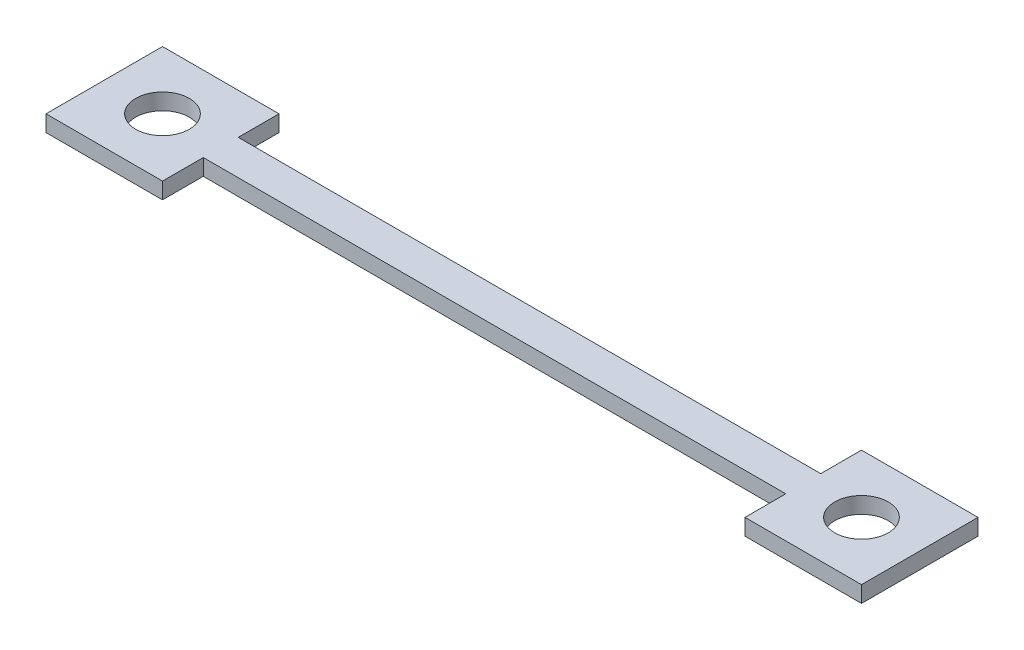
ISO-10303-21;
HEADER;
FILE_DESCRIPTION(('STEP AP214'),'2;1');
FILE_NAME('part.step','',(''),(''),'','','');
FILE_SCHEMA(('AUTOMOTIVE_DESIGN { 1 0 10303 214 1 1 1 1 }'));
ENDSEC;
DATA;
#1=APPLICATION_CONTEXT('core data for automotive mechanical design processes');
#2=APPLICATION_PROTOCOL_DEFINITION('international standard','automotive_design',2000,#1);
#3=PRODUCT_CONTEXT('',#1,'mechanical');
#4=PRODUCT('Part','Part','',(#3));
#5=PRODUCT_RELATED_PRODUCT_CATEGORY('part','',(#4));
#6=PRODUCT_DEFINITION_FORMATION('','',#4);
#7=PRODUCT_DEFINITION_CONTEXT('part definition',#1,'design');
#8=PRODUCT_DEFINITION('design','',#6,#7);
#9=PRODUCT_DEFINITION_SHAPE('','',#8);
#10=(LENGTH_UNIT() NAMED_UNIT(*) SI_UNIT(.MILLI.,.METRE.));
#11=(NAMED_UNIT(*) PLANE_ANGLE_UNIT() SI_UNIT($,.RADIAN.));
#12=(NAMED_UNIT(*) SI_UNIT($,.STERADIAN.) SOLID_ANGLE_UNIT());
#13=UNCERTAINTY_MEASURE_WITH_UNIT(LENGTH_MEASURE(1.E-05),#10,'distance_accuracy_value','');
#14=(GEOMETRIC_REPRESENTATION_CONTEXT(3) GLOBAL_UNCERTAINTY_ASSIGNED_CONTEXT((#13)) GLOBAL_UNIT_ASSIGNED_CONTEXT((#10,
#11,#12)) REPRESENTATION_CONTEXT('',''));
#15=CARTESIAN_POINT('',(0.,0.,0.));
#16=DIRECTION('',(0.,0.,1.));
#17=DIRECTION('',(1.,0.,0.));
#18=AXIS2_PLACEMENT_3D('',#15,#16,#17);
#19=CARTESIAN_POINT('',(-9.67404648456241,0.4445,6.15575946530759));
#20=DIRECTION('',(0.,0.,1.));
#21=DIRECTION('',(1.,0.,0.));
#22=AXIS2_PLACEMENT_3D('',#19,#20,#21);
#23=PLANE('',#22);
#24=DIRECTION('',(-1.,0.,0.));
#25=VECTOR('',#24,1.);
#26=CARTESIAN_POINT('',(-9.67404648456241,-0.4445,6.15575946530759));
#27=LINE('',#26,#25);
#28=CARTESIAN_POINT('',(-3.32404648456241,-0.4445,6.15575946530759));
#29=VERTEX_POINT('',#28);
#30=CARTESIAN_POINT('',(-9.67404648456241,-0.4445,6.15575946530759));
#31=VERTEX_POINT('',#30);
#32=EDGE_CURVE('E164',#29,#31,#27,.T.);
#33=ORIENTED_EDGE('',*,*,#32,.T.);
#34=DIRECTION('',(0.,-1.,0.));
#35=VECTOR('',#34,1.);
#36=CARTESIAN_POINT('',(-9.67404648456241,0.4445,6.15575946530759));
#37=LINE('',#36,#35);
#38=CARTESIAN_POINT('',(-9.67404648456241,0.4445,6.15575946530759));
#39=VERTEX_POINT('',#38);
#40=EDGE_CURVE('E11',#39,#31,#37,.T.);
#41=ORIENTED_EDGE('',*,*,#40,.F.);
#42=DIRECTION('',(-1.,0.,0.));
#43=VECTOR('',#42,1.);
#44=CARTESIAN_POINT('',(-9.67404648456241,0.4445,6.15575946530759));
#45=LINE('',#44,#43);
#46=CARTESIAN_POINT('',(-3.32404648456241,0.4445,6.15575946530759));
#47=VERTEX_POINT('',#46);
#48=EDGE_CURVE('E199',#47,#39,#45,.T.);
#49=ORIENTED_EDGE('',*,*,#48,.F.);
#50=DIRECTION('',(0.,-1.,0.));
#51=VECTOR('',#50,1.);
#52=CARTESIAN_POINT('',(-3.32404648456241,0.4445,6.15575946530759));
#53=LINE('',#52,#51);
#54=EDGE_CURVE('E160',#47,#29,#53,.T.);
#55=ORIENTED_EDGE('',*,*,#54,.T.);
#56=EDGE_LOOP('',(#33,#41,#49,#55));
#57=FACE_BOUND('',#56,.T.);
#58=ADVANCED_FACE('F39',(#57),#23,.F.);
#59=CARTESIAN_POINT('',(-9.67404648456241,0.4445,8.37825946530759));
#60=DIRECTION('',(1.,0.,0.));
#61=DIRECTION('',(0.,0.,-1.));
#62=AXIS2_PLACEMENT_3D('',#59,#60,#61);
#63=PLANE('',#62);
#64=DIRECTION('',(0.,0.,1.));
#65=VECTOR('',#64,1.);
#66=CARTESIAN_POINT('',(-9.67404648456241,-0.4445,8.37825946530759));
#67=LINE('',#66,#65);
#68=CARTESIAN_POINT('',(-9.67404648456241,-0.4445,8.37825946530759));
#69=VERTEX_POINT('',#68);
#70=EDGE_CURVE('E168',#31,#69,#67,.T.);
#71=ORIENTED_EDGE('',*,*,#70,.T.);
#72=DIRECTION('',(0.,-1.,0.));
#73=VECTOR('',#72,1.);
#74=CARTESIAN_POINT('',(-9.67404648456241,0.4445,8.37825946530759));
#75=LINE('',#74,#73);
#76=CARTESIAN_POINT('',(-9.67404648456241,0.4445,8.37825946530759));
#77=VERTEX_POINT('',#76);
#78=EDGE_CURVE('E48',#77,#69,#75,.T.);
#79=ORIENTED_EDGE('',*,*,#78,.F.);
#80=DIRECTION('',(0.,0.,1.));
#81=VECTOR('',#80,1.);
#82=CARTESIAN_POINT('',(-9.67404648456241,0.4445,8.37825946530759));
#83=LINE('',#82,#81);
#84=EDGE_CURVE('E111',#39,#77,#83,.T.);
#85=ORIENTED_EDGE('',*,*,#84,.F.);
#86=ORIENTED_EDGE('',*,*,#40,.T.);
#87=EDGE_LOOP('',(#71,#79,#85,#86));
#88=FACE_BOUND('',#87,.T.);
#89=ADVANCED_FACE('F294',(#88),#63,.F.);
#90=CARTESIAN_POINT('',(-41.4240464845624,0.4445,8.37825946530759));
#91=DIRECTION('',(0.,0.,1.));
#92=DIRECTION('',(1.,0.,0.));
#93=AXIS2_PLACEMENT_3D('',#90,#91,#92);
#94=PLANE('',#93);
#95=DIRECTION('',(-1.,0.,0.));
#96=VECTOR('',#95,1.);
#97=CARTESIAN_POINT('',(-41.4240464845624,-0.4445,8.37825946530759));
#98=LINE('',#97,#96);
#99=CARTESIAN_POINT('',(-41.4240464845624,-0.4445,8.37825946530759));
#100=VERTEX_POINT('',#99);
#101=EDGE_CURVE('E172',#69,#100,#98,.T.);
#102=ORIENTED_EDGE('',*,*,#101,.T.);
#103=DIRECTION('',(0.,-1.,0.));
#104=VECTOR('',#103,1.);
#105=CARTESIAN_POINT('',(-41.4240464845624,0.4445,8.37825946530759));
#106=LINE('',#105,#104);
#107=CARTESIAN_POINT('',(-41.4240464845624,0.4445,8.37825946530759));
#108=VERTEX_POINT('',#107);
#109=EDGE_CURVE('E226',#108,#100,#106,.T.);
#110=ORIENTED_EDGE('',*,*,#109,.F.);
#111=DIRECTION('',(-1.,0.,0.));
#112=VECTOR('',#111,1.);
#113=CARTESIAN_POINT('',(-41.4240464845624,0.4445,8.37825946530759));
#114=LINE('',#113,#112);
#115=EDGE_CURVE('E236',#77,#108,#114,.T.);
#116=ORIENTED_EDGE('',*,*,#115,.F.);
#117=ORIENTED_EDGE('',*,*,#78,.T.);
#118=EDGE_LOOP('',(#102,#110,#116,#117));
#119=FACE_BOUND('',#118,.T.);
#120=ADVANCED_FACE('F234',(#119),#94,.F.);
#121=CARTESIAN_POINT('',(-41.4240464845624,0.4445,8.37825946530759));
#122=DIRECTION('',(-1.,0.,0.));
#123=DIRECTION('',(0.,0.,1.));
#124=AXIS2_PLACEMENT_3D('',#121,#122,#123);
#125=PLANE('',#124);
#126=DIRECTION('',(0.,0.,-1.));
#127=VECTOR('',#126,1.);
#128=CARTESIAN_POINT('',(-41.4240464845624,-0.4445,8.37825946530759));
#129=LINE('',#128,#127);
#130=CARTESIAN_POINT('',(-41.4240464845624,-0.4445,6.15575946530758));
#131=VERTEX_POINT('',#130);
#132=EDGE_CURVE('E175',#100,#131,#129,.T.);
#133=ORIENTED_EDGE('',*,*,#132,.T.);
#134=DIRECTION('',(0.,-1.,0.));
#135=VECTOR('',#134,1.);
#136=CARTESIAN_POINT('',(-41.4240464845624,0.4445,6.15575946530758));
#137=LINE('',#136,#135);
#138=CARTESIAN_POINT('',(-41.4240464845624,0.4445,6.15575946530758));
#139=VERTEX_POINT('',#138);
#140=EDGE_CURVE('E222',#139,#131,#137,.T.);
#141=ORIENTED_EDGE('',*,*,#140,.F.);
#142=DIRECTION('',(0.,0.,-1.));
#143=VECTOR('',#142,1.);
#144=CARTESIAN_POINT('',(-41.4240464845624,0.4445,8.37825946530759));
#145=LINE('',#144,#143);
#146=EDGE_CURVE('E255',#108,#139,#145,.T.);
#147=ORIENTED_EDGE('',*,*,#146,.F.);
#148=ORIENTED_EDGE('',*,*,#109,.T.);
#149=EDGE_LOOP('',(#133,#141,#147,#148));
#150=FACE_BOUND('',#149,.T.);
#151=ADVANCED_FACE('F245',(#150),#125,.F.);
#152=CARTESIAN_POINT('',(-47.7740464845624,0.4445,6.15575946530758));
#153=DIRECTION('',(0.,0.,1.));
#154=DIRECTION('',(1.,0.,0.));
#155=AXIS2_PLACEMENT_3D('',#152,#153,#154);
#156=PLANE('',#155);
#157=DIRECTION('',(-1.,0.,0.));
#158=VECTOR('',#157,1.);
#159=CARTESIAN_POINT('',(-47.7740464845624,-0.4445,6.15575946530758));
#160=LINE('',#159,#158);
#161=CARTESIAN_POINT('',(-47.7740464845624,-0.4445,6.15575946530758));
#162=VERTEX_POINT('',#161);
#163=EDGE_CURVE('E178',#131,#162,#160,.T.);
#164=ORIENTED_EDGE('',*,*,#163,.T.);
#165=DIRECTION('',(0.,-1.,0.));
#166=VECTOR('',#165,1.);
#167=CARTESIAN_POINT('',(-47.7740464845624,0.4445,6.15575946530758));
#168=LINE('',#167,#166);
#169=CARTESIAN_POINT('',(-47.7740464845624,0.4445,6.15575946530758));
#170=VERTEX_POINT('',#169);
#171=EDGE_CURVE('E218',#170,#162,#168,.T.);
#172=ORIENTED_EDGE('',*,*,#171,.F.);
#173=DIRECTION('',(-1.,0.,0.));
#174=VECTOR('',#173,1.);
#175=CARTESIAN_POINT('',(-47.7740464845624,0.4445,6.15575946530758));
#176=LINE('',#175,#174);
#177=EDGE_CURVE('E251',#139,#170,#176,.T.);
#178=ORIENTED_EDGE('',*,*,#177,.F.);
#179=ORIENTED_EDGE('',*,*,#140,.T.);
#180=EDGE_LOOP('',(#164,#172,#178,#179));
#181=FACE_BOUND('',#180,.T.);
#182=ADVANCED_FACE('F249',(#181),#156,.F.);
#183=CARTESIAN_POINT('',(-47.7740464845624,0.4445,12.5057594653076));
#184=DIRECTION('',(1.,0.,0.));
#185=DIRECTION('',(0.,0.,-1.));
#186=AXIS2_PLACEMENT_3D('',#183,#184,#185);
#187=PLANE('',#186);
#188=DIRECTION('',(0.,0.,1.));
#189=VECTOR('',#188,1.);
#190=CARTESIAN_POINT('',(-47.7740464845624,-0.4445,12.5057594653076));
#191=LINE('',#190,#189);
#192=CARTESIAN_POINT('',(-47.7740464845624,-0.4445,12.5057594653076));
#193=VERTEX_POINT('',#192);
#194=EDGE_CURVE('E181',#162,#193,#191,.T.);
#195=ORIENTED_EDGE('',*,*,#194,.T.);
#196=DIRECTION('',(0.,-1.,0.));
#197=VECTOR('',#196,1.);
#198=CARTESIAN_POINT('',(-47.7740464845624,0.4445,12.5057594653076));
#199=LINE('',#198,#197);
#200=CARTESIAN_POINT('',(-47.7740464845624,0.4445,12.5057594653076));
#201=VERTEX_POINT('',#200);
#202=EDGE_CURVE('E214',#201,#193,#199,.T.);
#203=ORIENTED_EDGE('',*,*,#202,.F.);
#204=DIRECTION('',(0.,0.,1.));
#205=VECTOR('',#204,1.);
#206=CARTESIAN_POINT('',(-47.7740464845624,0.4445,12.5057594653076));
#207=LINE('',#206,#205);
#208=EDGE_CURVE('E254',#170,#201,#207,.T.);
#209=ORIENTED_EDGE('',*,*,#208,.F.);
#210=ORIENTED_EDGE('',*,*,#171,.T.);
#211=EDGE_LOOP('',(#195,#203,#209,#210));
#212=FACE_BOUND('',#211,.T.);
#213=ADVANCED_FACE('F307',(#212),#187,.F.);
#214=CARTESIAN_POINT('',(-47.7740464845624,0.4445,12.5057594653076));
#215=DIRECTION('',(0.,0.,-1.));
#216=DIRECTION('',(-1.,0.,0.));
#217=AXIS2_PLACEMENT_3D('',#214,#215,#216);
#218=PLANE('',#217);
#219=DIRECTION('',(1.,0.,0.));
#220=VECTOR('',#219,1.);
#221=CARTESIAN_POINT('',(-47.7740464845624,-0.4445,12.5057594653076));
#222=LINE('',#221,#220);
#223=CARTESIAN_POINT('',(-41.4240464845624,-0.4445,12.5057594653076));
#224=VERTEX_POINT('',#223);
#225=EDGE_CURVE('E184',#193,#224,#222,.T.);
#226=ORIENTED_EDGE('',*,*,#225,.T.);
#227=DIRECTION('',(0.,-1.,0.));
#228=VECTOR('',#227,1.);
#229=CARTESIAN_POINT('',(-41.4240464845624,0.4445,12.5057594653076));
#230=LINE('',#229,#228);
#231=CARTESIAN_POINT('',(-41.4240464845624,0.4445,12.5057594653076));
#232=VERTEX_POINT('',#231);
#233=EDGE_CURVE('E210',#232,#224,#230,.T.);
#234=ORIENTED_EDGE('',*,*,#233,.F.);
#235=DIRECTION('',(1.,0.,0.));
#236=VECTOR('',#235,1.);
#237=CARTESIAN_POINT('',(-47.7740464845624,0.4445,12.5057594653076));
#238=LINE('',#237,#236);
#239=EDGE_CURVE('E259',#201,#232,#238,.T.);
#240=ORIENTED_EDGE('',*,*,#239,.F.);
#241=ORIENTED_EDGE('',*,*,#202,.T.);
#242=EDGE_LOOP('',(#226,#234,#240,#241));
#243=FACE_BOUND('',#242,.T.);
#244=ADVANCED_FACE('F310',(#243),#218,.F.);
#245=CARTESIAN_POINT('',(-41.4240464845624,0.4445,10.2832594653076));
#246=DIRECTION('',(-1.,0.,0.));
#247=DIRECTION('',(0.,0.,1.));
#248=AXIS2_PLACEMENT_3D('',#245,#246,#247);
#249=PLANE('',#248);
#250=DIRECTION('',(0.,0.,-1.));
#251=VECTOR('',#250,1.);
#252=CARTESIAN_POINT('',(-41.4240464845624,-0.4445,10.2832594653076));
#253=LINE('',#252,#251);
#254=CARTESIAN_POINT('',(-41.4240464845624,-0.4445,10.2832594653076));
#255=VERTEX_POINT('',#254);
#256=EDGE_CURVE('E187',#224,#255,#253,.T.);
#257=ORIENTED_EDGE('',*,*,#256,.T.);
#258=DIRECTION('',(0.,-1.,0.));
#259=VECTOR('',#258,1.);
#260=CARTESIAN_POINT('',(-41.4240464845624,0.4445,10.2832594653076));
#261=LINE('',#260,#259);
#262=CARTESIAN_POINT('',(-41.4240464845624,0.4445,10.2832594653076));
#263=VERTEX_POINT('',#262);
#264=EDGE_CURVE('E206',#263,#255,#261,.T.);
#265=ORIENTED_EDGE('',*,*,#264,.F.);
#266=DIRECTION('',(0.,0.,-1.));
#267=VECTOR('',#266,1.);
#268=CARTESIAN_POINT('',(-41.4240464845624,0.4445,10.2832594653076));
#269=LINE('',#268,#267);
#270=EDGE_CURVE('E266',#232,#263,#269,.T.);
#271=ORIENTED_EDGE('',*,*,#270,.F.);
#272=ORIENTED_EDGE('',*,*,#233,.T.);
#273=EDGE_LOOP('',(#257,#265,#271,#272));
#274=FACE_BOUND('',#273,.T.);
#275=ADVANCED_FACE('F274',(#274),#249,.F.);
#276=CARTESIAN_POINT('',(-41.4240464845624,0.4445,10.2832594653076));
#277=DIRECTION('',(0.,0.,-1.));
#278=DIRECTION('',(-1.,0.,0.));
#279=AXIS2_PLACEMENT_3D('',#276,#277,#278);
#280=PLANE('',#279);
#281=DIRECTION('',(1.,0.,0.));
#282=VECTOR('',#281,1.);
#283=CARTESIAN_POINT('',(-41.4240464845624,-0.4445,10.2832594653076));
#284=LINE('',#283,#282);
#285=CARTESIAN_POINT('',(-9.67404648456241,-0.4445,10.2832594653076));
#286=VERTEX_POINT('',#285);
#287=EDGE_CURVE('E190',#255,#286,#284,.T.);
#288=ORIENTED_EDGE('',*,*,#287,.T.);
#289=DIRECTION('',(0.,-1.,0.));
#290=VECTOR('',#289,1.);
#291=CARTESIAN_POINT('',(-9.67404648456241,0.4445,10.2832594653076));
#292=LINE('',#291,#290);
#293=CARTESIAN_POINT('',(-9.67404648456241,0.4445,10.2832594653076));
#294=VERTEX_POINT('',#293);
#295=EDGE_CURVE('E153',#294,#286,#292,.T.);
#296=ORIENTED_EDGE('',*,*,#295,.F.);
#297=DIRECTION('',(1.,0.,0.));
#298=VECTOR('',#297,1.);
#299=CARTESIAN_POINT('',(-41.4240464845624,0.4445,10.2832594653076));
#300=LINE('',#299,#298);
#301=EDGE_CURVE('E142',#263,#294,#300,.T.);
#302=ORIENTED_EDGE('',*,*,#301,.F.);
#303=ORIENTED_EDGE('',*,*,#264,.T.);
#304=EDGE_LOOP('',(#288,#296,#302,#303));
#305=FACE_BOUND('',#304,.T.);
#306=ADVANCED_FACE('F278',(#305),#280,.F.);
#307=CARTESIAN_POINT('',(-9.67404648456241,0.4445,10.2832594653076));
#308=DIRECTION('',(1.,0.,0.));
#309=DIRECTION('',(0.,0.,-1.));
#310=AXIS2_PLACEMENT_3D('',#307,#308,#309);
#311=PLANE('',#310);
#312=DIRECTION('',(0.,0.,1.));
#313=VECTOR('',#312,1.);
#314=CARTESIAN_POINT('',(-9.67404648456241,-0.4445,10.2832594653076));
#315=LINE('',#314,#313);
#316=CARTESIAN_POINT('',(-9.67404648456241,-0.4445,12.5057594653076));
#317=VERTEX_POINT('',#316);
#318=EDGE_CURVE('E151',#286,#317,#315,.T.);
#319=ORIENTED_EDGE('',*,*,#318,.T.);
#320=DIRECTION('',(0.,-1.,0.));
#321=VECTOR('',#320,1.);
#322=CARTESIAN_POINT('',(-9.67404648456241,0.4445,12.5057594653076));
#323=LINE('',#322,#321);
#324=CARTESIAN_POINT('',(-9.67404648456241,0.4445,12.5057594653076));
#325=VERTEX_POINT('',#324);
#326=EDGE_CURVE('E148',#325,#317,#323,.T.);
#327=ORIENTED_EDGE('',*,*,#326,.F.);
#328=DIRECTION('',(0.,0.,1.));
#329=VECTOR('',#328,1.);
#330=CARTESIAN_POINT('',(-9.67404648456241,0.4445,10.2832594653076));
#331=LINE('',#330,#329);
#332=EDGE_CURVE('E136',#294,#325,#331,.T.);
#333=ORIENTED_EDGE('',*,*,#332,.F.);
#334=ORIENTED_EDGE('',*,*,#295,.T.);
#335=EDGE_LOOP('',(#319,#327,#333,#334));
#336=FACE_BOUND('',#335,.T.);
#337=ADVANCED_FACE('F149',(#336),#311,.F.);
#338=CARTESIAN_POINT('',(-9.67404648456241,0.4445,12.5057594653076));
#339=DIRECTION('',(0.,0.,-1.));
#340=DIRECTION('',(-1.,0.,0.));
#341=AXIS2_PLACEMENT_3D('',#338,#339,#340);
#342=PLANE('',#341);
#343=DIRECTION('',(1.,0.,0.));
#344=VECTOR('',#343,1.);
#345=CARTESIAN_POINT('',(-9.67404648456241,-0.4445,12.5057594653076));
#346=LINE('',#345,#344);
#347=CARTESIAN_POINT('',(-3.32404648456241,-0.4445,12.5057594653076));
#348=VERTEX_POINT('',#347);
#349=EDGE_CURVE('E97',#317,#348,#346,.T.);
#350=ORIENTED_EDGE('',*,*,#349,.T.);
#351=DIRECTION('',(0.,-1.,0.));
#352=VECTOR('',#351,1.);
#353=CARTESIAN_POINT('',(-3.32404648456241,0.4445,12.5057594653076));
#354=LINE('',#353,#352);
#355=CARTESIAN_POINT('',(-3.32404648456241,0.4445,12.5057594653076));
#356=VERTEX_POINT('',#355);
#357=EDGE_CURVE('E154',#356,#348,#354,.T.);
#358=ORIENTED_EDGE('',*,*,#357,.F.);
#359=DIRECTION('',(1.,0.,0.));
#360=VECTOR('',#359,1.);
#361=CARTESIAN_POINT('',(-9.67404648456241,0.4445,12.5057594653076));
#362=LINE('',#361,#360);
#363=EDGE_CURVE('E140',#325,#356,#362,.T.);
#364=ORIENTED_EDGE('',*,*,#363,.F.);
#365=ORIENTED_EDGE('',*,*,#326,.T.);
#366=EDGE_LOOP('',(#350,#358,#364,#365));
#367=FACE_BOUND('',#366,.T.);
#368=ADVANCED_FACE('F156',(#367),#342,.F.);
#369=CARTESIAN_POINT('',(-3.32404648456241,0.4445,12.5057594653076));
#370=DIRECTION('',(-1.,0.,0.));
#371=DIRECTION('',(0.,0.,1.));
#372=AXIS2_PLACEMENT_3D('',#369,#370,#371);
#373=PLANE('',#372);
#374=DIRECTION('',(0.,0.,-1.));
#375=VECTOR('',#374,1.);
#376=CARTESIAN_POINT('',(-3.32404648456241,-0.4445,12.5057594653076));
#377=LINE('',#376,#375);
#378=EDGE_CURVE('E103',#348,#29,#377,.T.);
#379=ORIENTED_EDGE('',*,*,#378,.T.);
#380=ORIENTED_EDGE('',*,*,#54,.F.);
#381=DIRECTION('',(0.,0.,-1.));
#382=VECTOR('',#381,1.);
#383=CARTESIAN_POINT('',(-3.32404648456241,0.4445,12.5057594653076));
#384=LINE('',#383,#382);
#385=EDGE_CURVE('E56',#356,#47,#384,.T.);
#386=ORIENTED_EDGE('',*,*,#385,.F.);
#387=ORIENTED_EDGE('',*,*,#357,.T.);
#388=EDGE_LOOP('',(#379,#380,#386,#387));
#389=FACE_BOUND('',#388,.T.);
#390=ADVANCED_FACE('F282',(#389),#373,.F.);
#391=CARTESIAN_POINT('',(-3.32404648456241,0.4445,6.15575946530759));
#392=DIRECTION('',(0.,1.,0.));
#393=DIRECTION('',(0.,0.,1.));
#394=AXIS2_PLACEMENT_3D('',#391,#392,#393);
#395=PLANE('',#394);
#396=CARTESIAN_POINT('',(-6.49904648456241,0.4445,9.33075946530758));
#397=DIRECTION('',(0.,1.,0.));
#398=DIRECTION('',(0.,0.,1.));
#399=AXIS2_PLACEMENT_3D('',#396,#397,#398);
#400=CIRCLE('',#399,1.4605);
#401=CARTESIAN_POINT('',(-6.49904648456241,0.4445,10.7912594653076));
#402=VERTEX_POINT('',#401);
#403=EDGE_CURVE('E376',#402,#402,#400,.T.);
#404=ORIENTED_EDGE('',*,*,#403,.F.);
#405=EDGE_LOOP('',(#404));
#406=FACE_BOUND('',#405,.T.);
#407=CARTESIAN_POINT('',(-44.5990464845624,0.4445,9.33075946530758));
#408=DIRECTION('',(0.,1.,0.));
#409=DIRECTION('',(0.,0.,1.));
#410=AXIS2_PLACEMENT_3D('',#407,#408,#409);
#411=CIRCLE('',#410,1.4605);
#412=CARTESIAN_POINT('',(-44.5990464845624,0.4445,10.7912594653076));
#413=VERTEX_POINT('',#412);
#414=EDGE_CURVE('E380',#413,#413,#411,.T.);
#415=ORIENTED_EDGE('',*,*,#414,.F.);
#416=EDGE_LOOP('',(#415));
#417=FACE_BOUND('',#416,.T.);
#418=ORIENTED_EDGE('',*,*,#48,.T.);
#419=ORIENTED_EDGE('',*,*,#84,.T.);
#420=ORIENTED_EDGE('',*,*,#115,.T.);
#421=ORIENTED_EDGE('',*,*,#146,.T.);
#422=ORIENTED_EDGE('',*,*,#177,.T.);
#423=ORIENTED_EDGE('',*,*,#208,.T.);
#424=ORIENTED_EDGE('',*,*,#239,.T.);
#425=ORIENTED_EDGE('',*,*,#270,.T.);
#426=ORIENTED_EDGE('',*,*,#301,.T.);
#427=ORIENTED_EDGE('',*,*,#332,.T.);
#428=ORIENTED_EDGE('',*,*,#363,.T.);
#429=ORIENTED_EDGE('',*,*,#385,.T.);
#430=EDGE_LOOP('',(#418,#419,#420,#421,#422,#423,#424,#425,#426,#427,#428,#429));
#431=FACE_BOUND('',#430,.T.);
#432=ADVANCED_FACE('F138',(#406,#417,#431),#395,.T.);
#433=CARTESIAN_POINT('',(-3.32404648456241,-0.4445,6.15575946530759));
#434=DIRECTION('',(0.,1.,0.));
#435=DIRECTION('',(0.,0.,1.));
#436=AXIS2_PLACEMENT_3D('',#433,#434,#435);
#437=PLANE('',#436);
#438=CARTESIAN_POINT('',(-6.49904648456241,-0.4445,9.33075946530758));
#439=DIRECTION('',(0.,1.,0.));
#440=DIRECTION('',(0.,0.,1.));
#441=AXIS2_PLACEMENT_3D('',#438,#439,#440);
#442=CIRCLE('',#441,1.4605);
#443=CARTESIAN_POINT('',(-6.49904648456241,-0.4445,10.7912594653076));
#444=VERTEX_POINT('',#443);
#445=EDGE_CURVE('E373',#444,#444,#442,.T.);
#446=ORIENTED_EDGE('',*,*,#445,.T.);
#447=EDGE_LOOP('',(#446));
#448=FACE_BOUND('',#447,.T.);
#449=CARTESIAN_POINT('',(-44.5990464845624,-0.4445,9.33075946530758));
#450=DIRECTION('',(0.,1.,0.));
#451=DIRECTION('',(0.,0.,1.));
#452=AXIS2_PLACEMENT_3D('',#449,#450,#451);
#453=CIRCLE('',#452,1.4605);
#454=CARTESIAN_POINT('',(-44.5990464845624,-0.4445,10.7912594653076));
#455=VERTEX_POINT('',#454);
#456=EDGE_CURVE('E169',#455,#455,#453,.T.);
#457=ORIENTED_EDGE('',*,*,#456,.T.);
#458=EDGE_LOOP('',(#457));
#459=FACE_BOUND('',#458,.T.);
#460=ORIENTED_EDGE('',*,*,#32,.F.);
#461=ORIENTED_EDGE('',*,*,#378,.F.);
#462=ORIENTED_EDGE('',*,*,#349,.F.);
#463=ORIENTED_EDGE('',*,*,#318,.F.);
#464=ORIENTED_EDGE('',*,*,#287,.F.);
#465=ORIENTED_EDGE('',*,*,#256,.F.);
#466=ORIENTED_EDGE('',*,*,#225,.F.);
#467=ORIENTED_EDGE('',*,*,#194,.F.);
#468=ORIENTED_EDGE('',*,*,#163,.F.);
#469=ORIENTED_EDGE('',*,*,#132,.F.);
#470=ORIENTED_EDGE('',*,*,#101,.F.);
#471=ORIENTED_EDGE('',*,*,#70,.F.);
#472=EDGE_LOOP('',(#460,#461,#462,#463,#464,#465,#466,#467,#468,#469,#470,#471));
#473=FACE_BOUND('',#472,.T.);
#474=ADVANCED_FACE('F240',(#448,#459,#473),#437,.F.);
#475=CARTESIAN_POINT('',(-44.5990464845624,0.4445,9.33075946530758));
#476=DIRECTION('',(0.,1.,0.));
#477=DIRECTION('',(0.,0.,1.));
#478=AXIS2_PLACEMENT_3D('',#475,#476,#477);
#479=CYLINDRICAL_SURFACE('',#478,1.4605);
#480=ORIENTED_EDGE('',*,*,#456,.F.);
#481=EDGE_LOOP('',(#480));
#482=FACE_BOUND('',#481,.T.);
#483=ORIENTED_EDGE('',*,*,#414,.T.);
#484=EDGE_LOOP('',(#483));
#485=FACE_BOUND('',#484,.T.);
#486=ADVANCED_FACE('F338',(#482,#485),#479,.F.);
#487=CARTESIAN_POINT('',(-6.49904648456241,0.4445,9.33075946530758));
#488=DIRECTION('',(0.,1.,0.));
#489=DIRECTION('',(0.,0.,1.));
#490=AXIS2_PLACEMENT_3D('',#487,#488,#489);
#491=CYLINDRICAL_SURFACE('',#490,1.4605);
#492=ORIENTED_EDGE('',*,*,#445,.F.);
#493=EDGE_LOOP('',(#492));
#494=FACE_BOUND('',#493,.T.);
#495=ORIENTED_EDGE('',*,*,#403,.T.);
#496=EDGE_LOOP('',(#495));
#497=FACE_BOUND('',#496,.T.);
#498=ADVANCED_FACE('F343',(#494,#497),#491,.F.);
#499=CLOSED_SHELL('',(#58,#89,#120,#151,#182,#213,#244,#275,#306,#337,#368,#390,#432,#474,#486,#498));
#500=MANIFOLD_SOLID_BREP('B2',#499);
#501=ADVANCED_BREP_SHAPE_REPRESENTATION('',(#18,#500),#14);
#502=SHAPE_DEFINITION_REPRESENTATION(#9,#501);
ENDSEC;
END-ISO-10303-21;
